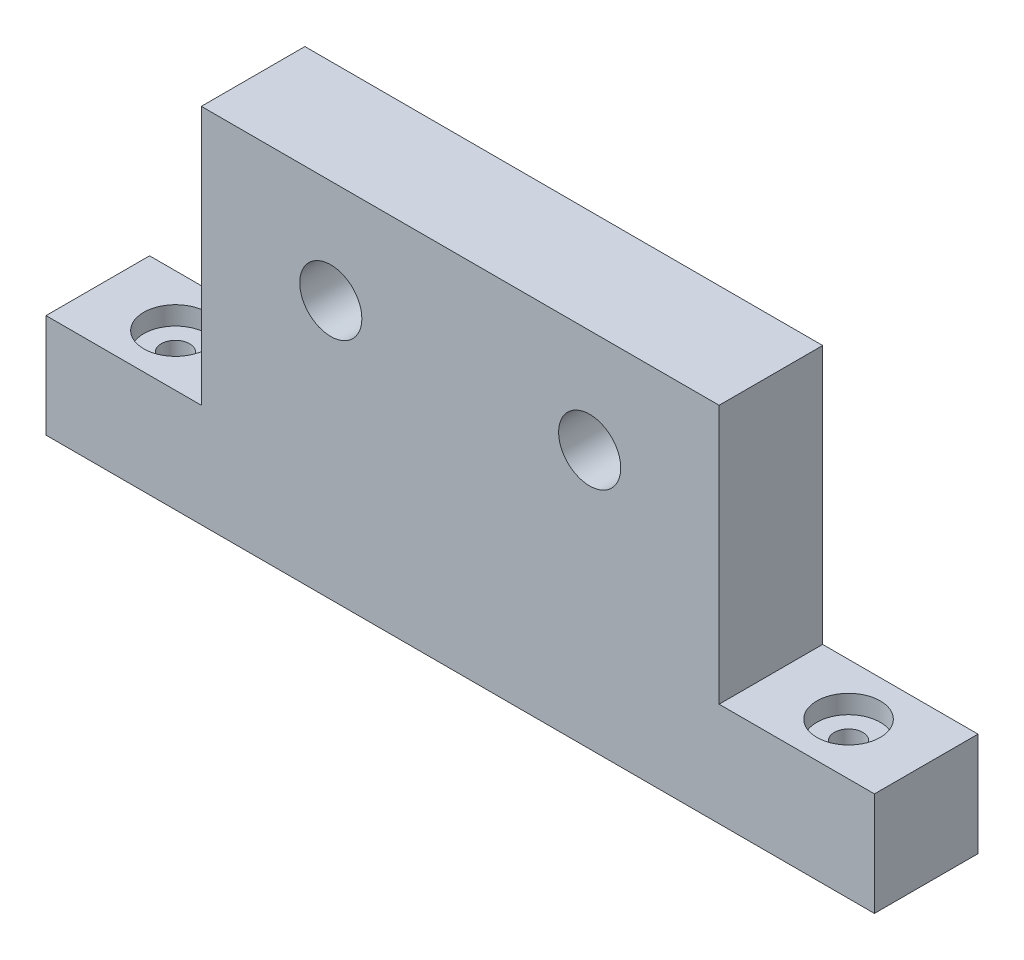
ISO-10303-21;
HEADER;
FILE_DESCRIPTION(('STEP AP214'),'2;1');
FILE_NAME('part.step','',(''),(''),'','','');
FILE_SCHEMA(('AUTOMOTIVE_DESIGN { 1 0 10303 214 1 1 1 1 }'));
ENDSEC;
DATA;
#1=APPLICATION_CONTEXT('core data for automotive mechanical design processes');
#2=APPLICATION_PROTOCOL_DEFINITION('international standard','automotive_design',2000,#1);
#3=PRODUCT_CONTEXT('',#1,'mechanical');
#4=PRODUCT('Part','Part','',(#3));
#5=PRODUCT_RELATED_PRODUCT_CATEGORY('part','',(#4));
#6=PRODUCT_DEFINITION_FORMATION('','',#4);
#7=PRODUCT_DEFINITION_CONTEXT('part definition',#1,'design');
#8=PRODUCT_DEFINITION('design','',#6,#7);
#9=PRODUCT_DEFINITION_SHAPE('','',#8);
#10=(LENGTH_UNIT() NAMED_UNIT(*) SI_UNIT(.MILLI.,.METRE.));
#11=(NAMED_UNIT(*) PLANE_ANGLE_UNIT() SI_UNIT($,.RADIAN.));
#12=(NAMED_UNIT(*) SI_UNIT($,.STERADIAN.) SOLID_ANGLE_UNIT());
#13=UNCERTAINTY_MEASURE_WITH_UNIT(LENGTH_MEASURE(1.E-05),#10,'distance_accuracy_value','');
#14=(GEOMETRIC_REPRESENTATION_CONTEXT(3) GLOBAL_UNCERTAINTY_ASSIGNED_CONTEXT((#13)) GLOBAL_UNIT_ASSIGNED_CONTEXT((#10,
#11,#12)) REPRESENTATION_CONTEXT('',''));
#15=CARTESIAN_POINT('',(0.,0.,0.));
#16=DIRECTION('',(0.,0.,1.));
#17=DIRECTION('',(1.,0.,0.));
#18=AXIS2_PLACEMENT_3D('',#15,#16,#17);
#19=CARTESIAN_POINT('',(80.,20.,20.));
#20=DIRECTION('',(0.,-1.,0.));
#21=DIRECTION('',(0.,0.,-1.));
#22=AXIS2_PLACEMENT_3D('',#19,#20,#21);
#23=PLANE('',#22);
#24=DIRECTION('',(-1.,0.,0.));
#25=VECTOR('',#24,1.);
#26=CARTESIAN_POINT('',(80.,20.,0.));
#27=LINE('',#26,#25);
#28=CARTESIAN_POINT('',(80.,20.,0.));
#29=VERTEX_POINT('',#28);
#30=CARTESIAN_POINT('',(50.,20.,0.));
#31=VERTEX_POINT('',#30);
#32=EDGE_CURVE('E82',#29,#31,#27,.T.);
#33=ORIENTED_EDGE('',*,*,#32,.T.);
#34=DIRECTION('',(0.,0.,-1.));
#35=VECTOR('',#34,1.);
#36=CARTESIAN_POINT('',(50.,20.,20.));
#37=LINE('',#36,#35);
#38=CARTESIAN_POINT('',(50.,20.,20.));
#39=VERTEX_POINT('',#38);
#40=EDGE_CURVE('E126',#39,#31,#37,.T.);
#41=ORIENTED_EDGE('',*,*,#40,.F.);
#42=DIRECTION('',(-1.,0.,0.));
#43=VECTOR('',#42,1.);
#44=CARTESIAN_POINT('',(80.,20.,20.));
#45=LINE('',#44,#43);
#46=CARTESIAN_POINT('',(80.,20.,20.));
#47=VERTEX_POINT('',#46);
#48=EDGE_CURVE('E114',#47,#39,#45,.T.);
#49=ORIENTED_EDGE('',*,*,#48,.F.);
#50=DIRECTION('',(0.,0.,-1.));
#51=VECTOR('',#50,1.);
#52=CARTESIAN_POINT('',(80.,20.,20.));
#53=LINE('',#52,#51);
#54=EDGE_CURVE('E121',#47,#29,#53,.T.);
#55=ORIENTED_EDGE('',*,*,#54,.T.);
#56=EDGE_LOOP('',(#33,#41,#49,#55));
#57=FACE_BOUND('',#56,.T.);
#58=CARTESIAN_POINT('',(65.,20.,10.));
#59=DIRECTION('',(0.,1.,0.));
#60=DIRECTION('',(0.,0.,1.));
#61=AXIS2_PLACEMENT_3D('',#58,#59,#60);
#62=CIRCLE('',#61,6.12);
#63=CARTESIAN_POINT('',(65.,20.,16.12));
#64=VERTEX_POINT('',#63);
#65=EDGE_CURVE('E204',#64,#64,#62,.T.);
#66=ORIENTED_EDGE('',*,*,#65,.F.);
#67=EDGE_LOOP('',(#66));
#68=FACE_BOUND('',#67,.T.);
#69=ADVANCED_FACE('F36',(#57,#68),#23,.F.);
#70=CARTESIAN_POINT('',(0.,0.,20.));
#71=DIRECTION('',(0.,0.,-1.));
#72=DIRECTION('',(-1.,0.,0.));
#73=AXIS2_PLACEMENT_3D('',#70,#71,#72);
#74=PLANE('',#73);
#75=DIRECTION('',(-1.,0.,0.));
#76=VECTOR('',#75,1.);
#77=CARTESIAN_POINT('',(50.,70.,20.));
#78=LINE('',#77,#76);
#79=CARTESIAN_POINT('',(50.,70.,20.));
#80=VERTEX_POINT('',#79);
#81=CARTESIAN_POINT('',(-50.,70.,20.));
#82=VERTEX_POINT('',#81);
#83=EDGE_CURVE('E95',#80,#82,#78,.T.);
#84=ORIENTED_EDGE('',*,*,#83,.T.);
#85=DIRECTION('',(0.,-1.,0.));
#86=VECTOR('',#85,1.);
#87=CARTESIAN_POINT('',(-50.,20.,20.));
#88=LINE('',#87,#86);
#89=CARTESIAN_POINT('',(-50.,20.,20.));
#90=VERTEX_POINT('',#89);
#91=EDGE_CURVE('E181',#82,#90,#88,.T.);
#92=ORIENTED_EDGE('',*,*,#91,.T.);
#93=DIRECTION('',(-1.,0.,0.));
#94=VECTOR('',#93,1.);
#95=CARTESIAN_POINT('',(-80.,20.,20.));
#96=LINE('',#95,#94);
#97=CARTESIAN_POINT('',(-80.,20.,20.));
#98=VERTEX_POINT('',#97);
#99=EDGE_CURVE('E164',#90,#98,#96,.T.);
#100=ORIENTED_EDGE('',*,*,#99,.T.);
#101=DIRECTION('',(0.,-1.,0.));
#102=VECTOR('',#101,1.);
#103=CARTESIAN_POINT('',(-80.,0.,20.));
#104=LINE('',#103,#102);
#105=CARTESIAN_POINT('',(-80.,0.,20.));
#106=VERTEX_POINT('',#105);
#107=EDGE_CURVE('E177',#98,#106,#104,.T.);
#108=ORIENTED_EDGE('',*,*,#107,.T.);
#109=DIRECTION('',(1.,0.,0.));
#110=VECTOR('',#109,1.);
#111=CARTESIAN_POINT('',(80.,0.,20.));
#112=LINE('',#111,#110);
#113=CARTESIAN_POINT('',(80.,0.,20.));
#114=VERTEX_POINT('',#113);
#115=EDGE_CURVE('E116',#106,#114,#112,.T.);
#116=ORIENTED_EDGE('',*,*,#115,.T.);
#117=DIRECTION('',(0.,1.,0.));
#118=VECTOR('',#117,1.);
#119=CARTESIAN_POINT('',(80.,0.,20.));
#120=LINE('',#119,#118);
#121=EDGE_CURVE('E109',#114,#47,#120,.T.);
#122=ORIENTED_EDGE('',*,*,#121,.T.);
#123=ORIENTED_EDGE('',*,*,#48,.T.);
#124=DIRECTION('',(0.,1.,0.));
#125=VECTOR('',#124,1.);
#126=CARTESIAN_POINT('',(50.,20.,20.));
#127=LINE('',#126,#125);
#128=EDGE_CURVE('E53',#39,#80,#127,.T.);
#129=ORIENTED_EDGE('',*,*,#128,.T.);
#130=EDGE_LOOP('',(#84,#92,#100,#108,#116,#122,#123,#129));
#131=FACE_BOUND('',#130,.T.);
#132=CARTESIAN_POINT('',(-25.,50.,20.));
#133=DIRECTION('',(0.,0.,1.));
#134=DIRECTION('',(1.,0.,0.));
#135=AXIS2_PLACEMENT_3D('',#132,#133,#134);
#136=CIRCLE('',#135,6.);
#137=CARTESIAN_POINT('',(-19.,50.,20.));
#138=VERTEX_POINT('',#137);
#139=EDGE_CURVE('E136',#138,#138,#136,.T.);
#140=ORIENTED_EDGE('',*,*,#139,.F.);
#141=EDGE_LOOP('',(#140));
#142=FACE_BOUND('',#141,.T.);
#143=CARTESIAN_POINT('',(25.,50.,20.));
#144=DIRECTION('',(0.,0.,1.));
#145=DIRECTION('',(-1.,0.,0.));
#146=AXIS2_PLACEMENT_3D('',#143,#144,#145);
#147=CIRCLE('',#146,6.);
#148=CARTESIAN_POINT('',(19.,50.,20.));
#149=VERTEX_POINT('',#148);
#150=EDGE_CURVE('E187',#149,#149,#147,.T.);
#151=ORIENTED_EDGE('',*,*,#150,.F.);
#152=EDGE_LOOP('',(#151));
#153=FACE_BOUND('',#152,.T.);
#154=ADVANCED_FACE('F111',(#131,#142,#153),#74,.F.);
#155=CARTESIAN_POINT('',(0.,0.,0.));
#156=DIRECTION('',(0.,0.,-1.));
#157=DIRECTION('',(-1.,0.,0.));
#158=AXIS2_PLACEMENT_3D('',#155,#156,#157);
#159=PLANE('',#158);
#160=CARTESIAN_POINT('',(-25.,50.,0.));
#161=DIRECTION('',(0.,0.,1.));
#162=DIRECTION('',(1.,0.,0.));
#163=AXIS2_PLACEMENT_3D('',#160,#161,#162);
#164=CIRCLE('',#163,6.);
#165=CARTESIAN_POINT('',(-19.,50.,0.));
#166=VERTEX_POINT('',#165);
#167=EDGE_CURVE('E184',#166,#166,#164,.T.);
#168=ORIENTED_EDGE('',*,*,#167,.T.);
#169=EDGE_LOOP('',(#168));
#170=FACE_BOUND('',#169,.T.);
#171=DIRECTION('',(-1.,0.,0.));
#172=VECTOR('',#171,1.);
#173=CARTESIAN_POINT('',(-50.,70.,0.));
#174=LINE('',#173,#172);
#175=CARTESIAN_POINT('',(50.,70.,0.));
#176=VERTEX_POINT('',#175);
#177=CARTESIAN_POINT('',(-50.,70.,0.));
#178=VERTEX_POINT('',#177);
#179=EDGE_CURVE('E89',#176,#178,#174,.T.);
#180=ORIENTED_EDGE('',*,*,#179,.F.);
#181=DIRECTION('',(0.,1.,0.));
#182=VECTOR('',#181,1.);
#183=CARTESIAN_POINT('',(50.,20.,0.));
#184=LINE('',#183,#182);
#185=EDGE_CURVE('E146',#31,#176,#184,.T.);
#186=ORIENTED_EDGE('',*,*,#185,.F.);
#187=ORIENTED_EDGE('',*,*,#32,.F.);
#188=DIRECTION('',(0.,1.,0.));
#189=VECTOR('',#188,1.);
#190=CARTESIAN_POINT('',(80.,0.,0.));
#191=LINE('',#190,#189);
#192=CARTESIAN_POINT('',(80.,0.,0.));
#193=VERTEX_POINT('',#192);
#194=EDGE_CURVE('E124',#193,#29,#191,.T.);
#195=ORIENTED_EDGE('',*,*,#194,.F.);
#196=DIRECTION('',(1.,0.,0.));
#197=VECTOR('',#196,1.);
#198=CARTESIAN_POINT('',(80.,0.,0.));
#199=LINE('',#198,#197);
#200=CARTESIAN_POINT('',(-80.,0.,0.));
#201=VERTEX_POINT('',#200);
#202=EDGE_CURVE('E142',#201,#193,#199,.T.);
#203=ORIENTED_EDGE('',*,*,#202,.F.);
#204=DIRECTION('',(0.,-1.,0.));
#205=VECTOR('',#204,1.);
#206=CARTESIAN_POINT('',(-80.,0.,0.));
#207=LINE('',#206,#205);
#208=CARTESIAN_POINT('',(-80.,20.,0.));
#209=VERTEX_POINT('',#208);
#210=EDGE_CURVE('E140',#209,#201,#207,.T.);
#211=ORIENTED_EDGE('',*,*,#210,.F.);
#212=DIRECTION('',(-1.,0.,0.));
#213=VECTOR('',#212,1.);
#214=CARTESIAN_POINT('',(-80.,20.,0.));
#215=LINE('',#214,#213);
#216=CARTESIAN_POINT('',(-50.,20.,0.));
#217=VERTEX_POINT('',#216);
#218=EDGE_CURVE('E138',#217,#209,#215,.T.);
#219=ORIENTED_EDGE('',*,*,#218,.F.);
#220=DIRECTION('',(0.,-1.,0.));
#221=VECTOR('',#220,1.);
#222=CARTESIAN_POINT('',(-50.,20.,0.));
#223=LINE('',#222,#221);
#224=EDGE_CURVE('E135',#178,#217,#223,.T.);
#225=ORIENTED_EDGE('',*,*,#224,.F.);
#226=EDGE_LOOP('',(#180,#186,#187,#195,#203,#211,#219,#225));
#227=FACE_BOUND('',#226,.T.);
#228=CARTESIAN_POINT('',(25.,50.,0.));
#229=DIRECTION('',(0.,0.,1.));
#230=DIRECTION('',(-1.,0.,0.));
#231=AXIS2_PLACEMENT_3D('',#228,#229,#230);
#232=CIRCLE('',#231,6.);
#233=CARTESIAN_POINT('',(19.,50.,0.));
#234=VERTEX_POINT('',#233);
#235=EDGE_CURVE('E190',#234,#234,#232,.T.);
#236=ORIENTED_EDGE('',*,*,#235,.T.);
#237=EDGE_LOOP('',(#236));
#238=FACE_BOUND('',#237,.T.);
#239=ADVANCED_FACE('F168',(#170,#227,#238),#159,.T.);
#240=CARTESIAN_POINT('',(-50.,70.,20.));
#241=DIRECTION('',(0.,-1.,0.));
#242=DIRECTION('',(0.,0.,-1.));
#243=AXIS2_PLACEMENT_3D('',#240,#241,#242);
#244=PLANE('',#243);
#245=ORIENTED_EDGE('',*,*,#179,.T.);
#246=DIRECTION('',(0.,0.,-1.));
#247=VECTOR('',#246,1.);
#248=CARTESIAN_POINT('',(-50.,70.,20.));
#249=LINE('',#248,#247);
#250=EDGE_CURVE('E11',#82,#178,#249,.T.);
#251=ORIENTED_EDGE('',*,*,#250,.F.);
#252=ORIENTED_EDGE('',*,*,#83,.F.);
#253=DIRECTION('',(0.,0.,-1.));
#254=VECTOR('',#253,1.);
#255=CARTESIAN_POINT('',(50.,70.,20.));
#256=LINE('',#255,#254);
#257=EDGE_CURVE('E130',#80,#176,#256,.T.);
#258=ORIENTED_EDGE('',*,*,#257,.T.);
#259=EDGE_LOOP('',(#245,#251,#252,#258));
#260=FACE_BOUND('',#259,.T.);
#261=ADVANCED_FACE('F38',(#260),#244,.F.);
#262=CARTESIAN_POINT('',(-50.,20.,20.));
#263=DIRECTION('',(1.,0.,0.));
#264=DIRECTION('',(0.,0.,-1.));
#265=AXIS2_PLACEMENT_3D('',#262,#263,#264);
#266=PLANE('',#265);
#267=ORIENTED_EDGE('',*,*,#224,.T.);
#268=DIRECTION('',(0.,0.,-1.));
#269=VECTOR('',#268,1.);
#270=CARTESIAN_POINT('',(-50.,20.,20.));
#271=LINE('',#270,#269);
#272=EDGE_CURVE('E45',#90,#217,#271,.T.);
#273=ORIENTED_EDGE('',*,*,#272,.F.);
#274=ORIENTED_EDGE('',*,*,#91,.F.);
#275=ORIENTED_EDGE('',*,*,#250,.T.);
#276=EDGE_LOOP('',(#267,#273,#274,#275));
#277=FACE_BOUND('',#276,.T.);
#278=ADVANCED_FACE('F223',(#277),#266,.F.);
#279=CARTESIAN_POINT('',(-80.,20.,20.));
#280=DIRECTION('',(0.,-1.,0.));
#281=DIRECTION('',(0.,0.,-1.));
#282=AXIS2_PLACEMENT_3D('',#279,#280,#281);
#283=PLANE('',#282);
#284=CARTESIAN_POINT('',(-65.,20.,10.));
#285=DIRECTION('',(0.,1.,0.));
#286=DIRECTION('',(0.,0.,1.));
#287=AXIS2_PLACEMENT_3D('',#284,#285,#286);
#288=CIRCLE('',#287,6.12);
#289=CARTESIAN_POINT('',(-65.,20.,16.12));
#290=VERTEX_POINT('',#289);
#291=EDGE_CURVE('E216',#290,#290,#288,.T.);
#292=ORIENTED_EDGE('',*,*,#291,.F.);
#293=EDGE_LOOP('',(#292));
#294=FACE_BOUND('',#293,.T.);
#295=ORIENTED_EDGE('',*,*,#218,.T.);
#296=DIRECTION('',(0.,0.,-1.));
#297=VECTOR('',#296,1.);
#298=CARTESIAN_POINT('',(-80.,20.,20.));
#299=LINE('',#298,#297);
#300=EDGE_CURVE('E155',#98,#209,#299,.T.);
#301=ORIENTED_EDGE('',*,*,#300,.F.);
#302=ORIENTED_EDGE('',*,*,#99,.F.);
#303=ORIENTED_EDGE('',*,*,#272,.T.);
#304=EDGE_LOOP('',(#295,#301,#302,#303));
#305=FACE_BOUND('',#304,.T.);
#306=ADVANCED_FACE('F162',(#294,#305),#283,.F.);
#307=CARTESIAN_POINT('',(-80.,0.,20.));
#308=DIRECTION('',(1.,0.,0.));
#309=DIRECTION('',(0.,0.,-1.));
#310=AXIS2_PLACEMENT_3D('',#307,#308,#309);
#311=PLANE('',#310);
#312=ORIENTED_EDGE('',*,*,#210,.T.);
#313=DIRECTION('',(0.,0.,-1.));
#314=VECTOR('',#313,1.);
#315=CARTESIAN_POINT('',(-80.,0.,20.));
#316=LINE('',#315,#314);
#317=EDGE_CURVE('E152',#106,#201,#316,.T.);
#318=ORIENTED_EDGE('',*,*,#317,.F.);
#319=ORIENTED_EDGE('',*,*,#107,.F.);
#320=ORIENTED_EDGE('',*,*,#300,.T.);
#321=EDGE_LOOP('',(#312,#318,#319,#320));
#322=FACE_BOUND('',#321,.T.);
#323=ADVANCED_FACE('F173',(#322),#311,.F.);
#324=CARTESIAN_POINT('',(80.,0.,20.));
#325=DIRECTION('',(0.,1.,0.));
#326=DIRECTION('',(0.,0.,1.));
#327=AXIS2_PLACEMENT_3D('',#324,#325,#326);
#328=PLANE('',#327);
#329=CARTESIAN_POINT('',(-65.,0.,10.));
#330=DIRECTION('',(0.,1.,0.));
#331=DIRECTION('',(0.,0.,1.));
#332=AXIS2_PLACEMENT_3D('',#329,#330,#331);
#333=CIRCLE('',#332,2.75);
#334=CARTESIAN_POINT('',(-65.,0.,12.75));
#335=VERTEX_POINT('',#334);
#336=EDGE_CURVE('E207',#335,#335,#333,.T.);
#337=ORIENTED_EDGE('',*,*,#336,.T.);
#338=EDGE_LOOP('',(#337));
#339=FACE_BOUND('',#338,.T.);
#340=CARTESIAN_POINT('',(65.,0.,10.));
#341=DIRECTION('',(0.,1.,0.));
#342=DIRECTION('',(0.,0.,1.));
#343=AXIS2_PLACEMENT_3D('',#340,#341,#342);
#344=CIRCLE('',#343,2.75);
#345=CARTESIAN_POINT('',(65.,0.,12.75));
#346=VERTEX_POINT('',#345);
#347=EDGE_CURVE('E193',#346,#346,#344,.T.);
#348=ORIENTED_EDGE('',*,*,#347,.T.);
#349=EDGE_LOOP('',(#348));
#350=FACE_BOUND('',#349,.T.);
#351=ORIENTED_EDGE('',*,*,#202,.T.);
#352=DIRECTION('',(0.,0.,-1.));
#353=VECTOR('',#352,1.);
#354=CARTESIAN_POINT('',(80.,0.,20.));
#355=LINE('',#354,#353);
#356=EDGE_CURVE('E125',#114,#193,#355,.T.);
#357=ORIENTED_EDGE('',*,*,#356,.F.);
#358=ORIENTED_EDGE('',*,*,#115,.F.);
#359=ORIENTED_EDGE('',*,*,#317,.T.);
#360=EDGE_LOOP('',(#351,#357,#358,#359));
#361=FACE_BOUND('',#360,.T.);
#362=ADVANCED_FACE('F176',(#339,#350,#361),#328,.F.);
#363=CARTESIAN_POINT('',(80.,0.,20.));
#364=DIRECTION('',(-1.,0.,0.));
#365=DIRECTION('',(0.,0.,1.));
#366=AXIS2_PLACEMENT_3D('',#363,#364,#365);
#367=PLANE('',#366);
#368=ORIENTED_EDGE('',*,*,#194,.T.);
#369=ORIENTED_EDGE('',*,*,#54,.F.);
#370=ORIENTED_EDGE('',*,*,#121,.F.);
#371=ORIENTED_EDGE('',*,*,#356,.T.);
#372=EDGE_LOOP('',(#368,#369,#370,#371));
#373=FACE_BOUND('',#372,.T.);
#374=ADVANCED_FACE('F122',(#373),#367,.F.);
#375=CARTESIAN_POINT('',(50.,20.,20.));
#376=DIRECTION('',(-1.,0.,0.));
#377=DIRECTION('',(0.,0.,1.));
#378=AXIS2_PLACEMENT_3D('',#375,#376,#377);
#379=PLANE('',#378);
#380=ORIENTED_EDGE('',*,*,#185,.T.);
#381=ORIENTED_EDGE('',*,*,#257,.F.);
#382=ORIENTED_EDGE('',*,*,#128,.F.);
#383=ORIENTED_EDGE('',*,*,#40,.T.);
#384=EDGE_LOOP('',(#380,#381,#382,#383));
#385=FACE_BOUND('',#384,.T.);
#386=ADVANCED_FACE('F238',(#385),#379,.F.);
#387=CARTESIAN_POINT('',(-25.,50.,20.));
#388=DIRECTION('',(0.,0.,-1.));
#389=DIRECTION('',(-1.,0.,0.));
#390=AXIS2_PLACEMENT_3D('',#387,#388,#389);
#391=CYLINDRICAL_SURFACE('',#390,6.);
#392=ORIENTED_EDGE('',*,*,#139,.T.);
#393=EDGE_LOOP('',(#392));
#394=FACE_BOUND('',#393,.T.);
#395=ORIENTED_EDGE('',*,*,#167,.F.);
#396=EDGE_LOOP('',(#395));
#397=FACE_BOUND('',#396,.T.);
#398=ADVANCED_FACE('F279',(#394,#397),#391,.F.);
#399=CARTESIAN_POINT('',(25.,50.,20.));
#400=DIRECTION('',(0.,0.,-1.));
#401=DIRECTION('',(-1.,0.,0.));
#402=AXIS2_PLACEMENT_3D('',#399,#400,#401);
#403=CYLINDRICAL_SURFACE('',#402,6.);
#404=ORIENTED_EDGE('',*,*,#150,.T.);
#405=EDGE_LOOP('',(#404));
#406=FACE_BOUND('',#405,.T.);
#407=ORIENTED_EDGE('',*,*,#235,.F.);
#408=EDGE_LOOP('',(#407));
#409=FACE_BOUND('',#408,.T.);
#410=ADVANCED_FACE('F254',(#406,#409),#403,.F.);
#411=CARTESIAN_POINT('',(65.,20.,10.));
#412=DIRECTION('',(0.,1.,0.));
#413=DIRECTION('',(0.,0.,1.));
#414=AXIS2_PLACEMENT_3D('',#411,#412,#413);
#415=CYLINDRICAL_SURFACE('',#414,2.75);
#416=ORIENTED_EDGE('',*,*,#347,.F.);
#417=EDGE_LOOP('',(#416));
#418=FACE_BOUND('',#417,.T.);
#419=CARTESIAN_POINT('',(65.,16.42,10.));
#420=DIRECTION('',(0.,1.,0.));
#421=DIRECTION('',(0.,0.,1.));
#422=AXIS2_PLACEMENT_3D('',#419,#420,#421);
#423=CIRCLE('',#422,2.75);
#424=CARTESIAN_POINT('',(65.,16.42,12.75));
#425=VERTEX_POINT('',#424);
#426=EDGE_CURVE('E198',#425,#425,#423,.T.);
#427=ORIENTED_EDGE('',*,*,#426,.T.);
#428=EDGE_LOOP('',(#427));
#429=FACE_BOUND('',#428,.T.);
#430=ADVANCED_FACE('F250',(#418,#429),#415,.F.);
#431=CARTESIAN_POINT('',(67.75,16.42,10.));
#432=DIRECTION('',(0.,-1.,0.));
#433=DIRECTION('',(0.,0.,-1.));
#434=AXIS2_PLACEMENT_3D('',#431,#432,#433);
#435=PLANE('',#434);
#436=ORIENTED_EDGE('',*,*,#426,.F.);
#437=EDGE_LOOP('',(#436));
#438=FACE_BOUND('',#437,.T.);
#439=CARTESIAN_POINT('',(65.,16.42,10.));
#440=DIRECTION('',(0.,1.,0.));
#441=DIRECTION('',(0.,0.,1.));
#442=AXIS2_PLACEMENT_3D('',#439,#440,#441);
#443=CIRCLE('',#442,6.12);
#444=CARTESIAN_POINT('',(65.,16.42,16.12));
#445=VERTEX_POINT('',#444);
#446=EDGE_CURVE('E201',#445,#445,#443,.T.);
#447=ORIENTED_EDGE('',*,*,#446,.T.);
#448=EDGE_LOOP('',(#447));
#449=FACE_BOUND('',#448,.T.);
#450=ADVANCED_FACE('F253',(#438,#449),#435,.F.);
#451=CARTESIAN_POINT('',(65.,20.,10.));
#452=DIRECTION('',(0.,1.,0.));
#453=DIRECTION('',(0.,0.,1.));
#454=AXIS2_PLACEMENT_3D('',#451,#452,#453);
#455=CYLINDRICAL_SURFACE('',#454,6.12);
#456=ORIENTED_EDGE('',*,*,#446,.F.);
#457=EDGE_LOOP('',(#456));
#458=FACE_BOUND('',#457,.T.);
#459=ORIENTED_EDGE('',*,*,#65,.T.);
#460=EDGE_LOOP('',(#459));
#461=FACE_BOUND('',#460,.T.);
#462=ADVANCED_FACE('F260',(#458,#461),#455,.F.);
#463=CARTESIAN_POINT('',(-65.,20.,10.));
#464=DIRECTION('',(0.,1.,0.));
#465=DIRECTION('',(0.,0.,1.));
#466=AXIS2_PLACEMENT_3D('',#463,#464,#465);
#467=CYLINDRICAL_SURFACE('',#466,2.75);
#468=ORIENTED_EDGE('',*,*,#336,.F.);
#469=EDGE_LOOP('',(#468));
#470=FACE_BOUND('',#469,.T.);
#471=CARTESIAN_POINT('',(-65.,16.42,10.));
#472=DIRECTION('',(0.,1.,0.));
#473=DIRECTION('',(0.,0.,1.));
#474=AXIS2_PLACEMENT_3D('',#471,#472,#473);
#475=CIRCLE('',#474,2.75);
#476=CARTESIAN_POINT('',(-65.,16.42,12.75));
#477=VERTEX_POINT('',#476);
#478=EDGE_CURVE('E210',#477,#477,#475,.T.);
#479=ORIENTED_EDGE('',*,*,#478,.T.);
#480=EDGE_LOOP('',(#479));
#481=FACE_BOUND('',#480,.T.);
#482=ADVANCED_FACE('F266',(#470,#481),#467,.F.);
#483=CARTESIAN_POINT('',(-62.25,16.42,10.));
#484=DIRECTION('',(0.,-1.,0.));
#485=DIRECTION('',(0.,0.,-1.));
#486=AXIS2_PLACEMENT_3D('',#483,#484,#485);
#487=PLANE('',#486);
#488=ORIENTED_EDGE('',*,*,#478,.F.);
#489=EDGE_LOOP('',(#488));
#490=FACE_BOUND('',#489,.T.);
#491=CARTESIAN_POINT('',(-65.,16.42,10.));
#492=DIRECTION('',(0.,1.,0.));
#493=DIRECTION('',(0.,0.,1.));
#494=AXIS2_PLACEMENT_3D('',#491,#492,#493);
#495=CIRCLE('',#494,6.12);
#496=CARTESIAN_POINT('',(-65.,16.42,16.12));
#497=VERTEX_POINT('',#496);
#498=EDGE_CURVE('E213',#497,#497,#495,.T.);
#499=ORIENTED_EDGE('',*,*,#498,.T.);
#500=EDGE_LOOP('',(#499));
#501=FACE_BOUND('',#500,.T.);
#502=ADVANCED_FACE('F272',(#490,#501),#487,.F.);
#503=CARTESIAN_POINT('',(-65.,20.,10.));
#504=DIRECTION('',(0.,1.,0.));
#505=DIRECTION('',(0.,0.,1.));
#506=AXIS2_PLACEMENT_3D('',#503,#504,#505);
#507=CYLINDRICAL_SURFACE('',#506,6.12);
#508=ORIENTED_EDGE('',*,*,#498,.F.);
#509=EDGE_LOOP('',(#508));
#510=FACE_BOUND('',#509,.T.);
#511=ORIENTED_EDGE('',*,*,#291,.T.);
#512=EDGE_LOOP('',(#511));
#513=FACE_BOUND('',#512,.T.);
#514=ADVANCED_FACE('F220',(#510,#513),#507,.F.);
#515=CLOSED_SHELL('',(#69,#154,#239,#261,#278,#306,#323,#362,#374,#386,#398,#410,#430,#450,#462,
#482,#502,#514));
#516=MANIFOLD_SOLID_BREP('B2',#515);
#517=ADVANCED_BREP_SHAPE_REPRESENTATION('',(#18,#516),#14);
#518=SHAPE_DEFINITION_REPRESENTATION(#9,#517);
ENDSEC;
END-ISO-10303-21;
